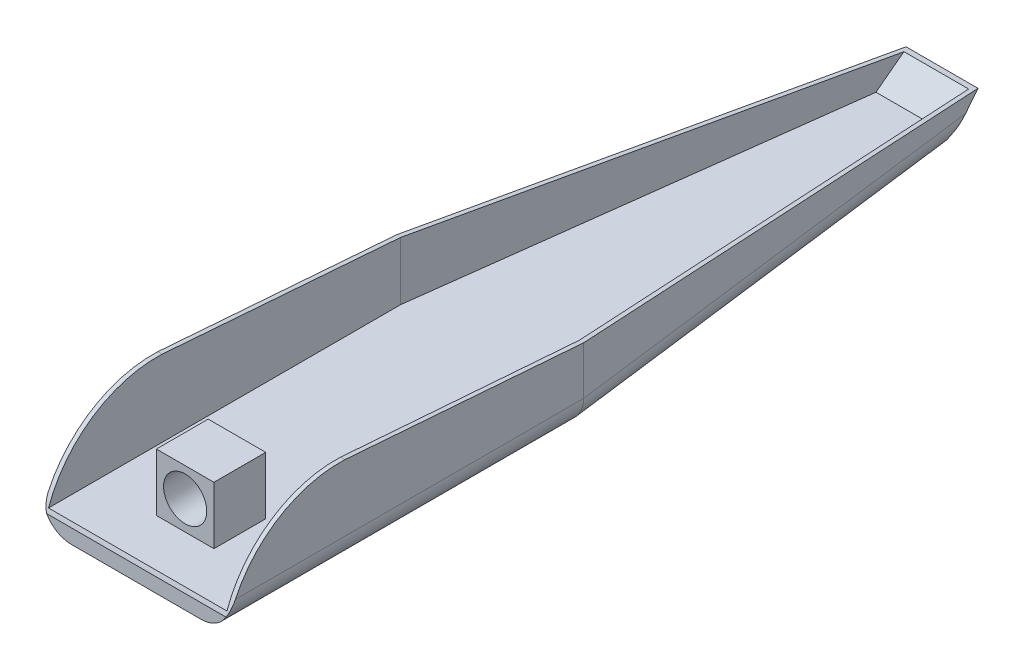
ISO-10303-21;
HEADER;
FILE_DESCRIPTION(('STEP AP214'),'2;1');
FILE_NAME('part.step','',(''),(''),'','','');
FILE_SCHEMA(('AUTOMOTIVE_DESIGN { 1 0 10303 214 1 1 1 1 }'));
ENDSEC;
DATA;
#1=APPLICATION_CONTEXT('core data for automotive mechanical design processes');
#2=APPLICATION_PROTOCOL_DEFINITION('international standard','automotive_design',2000,#1);
#3=PRODUCT_CONTEXT('',#1,'mechanical');
#4=PRODUCT('Part','Part','',(#3));
#5=PRODUCT_RELATED_PRODUCT_CATEGORY('part','',(#4));
#6=PRODUCT_DEFINITION_FORMATION('','',#4);
#7=PRODUCT_DEFINITION_CONTEXT('part definition',#1,'design');
#8=PRODUCT_DEFINITION('design','',#6,#7);
#9=PRODUCT_DEFINITION_SHAPE('','',#8);
#10=(LENGTH_UNIT() NAMED_UNIT(*) SI_UNIT(.MILLI.,.METRE.));
#11=(NAMED_UNIT(*) PLANE_ANGLE_UNIT() SI_UNIT($,.RADIAN.));
#12=(NAMED_UNIT(*) SI_UNIT($,.STERADIAN.) SOLID_ANGLE_UNIT());
#13=UNCERTAINTY_MEASURE_WITH_UNIT(LENGTH_MEASURE(1.E-05),#10,'distance_accuracy_value','');
#14=(GEOMETRIC_REPRESENTATION_CONTEXT(3) GLOBAL_UNCERTAINTY_ASSIGNED_CONTEXT((#13)) GLOBAL_UNIT_ASSIGNED_CONTEXT((#10,
#11,#12)) REPRESENTATION_CONTEXT('',''));
#15=CARTESIAN_POINT('',(0.,0.,0.));
#16=DIRECTION('',(0.,0.,1.));
#17=DIRECTION('',(1.,0.,0.));
#18=AXIS2_PLACEMENT_3D('',#15,#16,#17);
#19=CARTESIAN_POINT('',(65.,1.5,106.357678166438));
#20=DIRECTION('',(0.,1.,0.));
#21=DIRECTION('',(0.,0.,1.));
#22=AXIS2_PLACEMENT_3D('',#19,#20,#21);
#23=PLANE('',#22);
#24=DIRECTION('',(-0.126367327048423,0.,-0.99198351733012));
#25=VECTOR('',#24,1.);
#26=CARTESIAN_POINT('',(78.9306043080202,1.5,104.583078891531));
#27=LINE('',#26,#25);
#28=CARTESIAN_POINT('',(63.5,1.5,-16.5471649264268));
#29=VERTEX_POINT('',#28);
#30=CARTESIAN_POINT('',(44.8397726787976,1.5,-163.029949397866));
#31=VERTEX_POINT('',#30);
#32=EDGE_CURVE('E213',#29,#31,#27,.T.);
#33=ORIENTED_EDGE('',*,*,#32,.T.);
#34=DIRECTION('',(-1.,0.,0.));
#35=VECTOR('',#34,1.);
#36=CARTESIAN_POINT('',(65.,1.5,-163.029949397866));
#37=LINE('',#36,#35);
#38=CARTESIAN_POINT('',(20.1602273212024,1.5,-163.029949397866));
#39=VERTEX_POINT('',#38);
#40=EDGE_CURVE('E230',#31,#39,#37,.T.);
#41=ORIENTED_EDGE('',*,*,#40,.T.);
#42=DIRECTION('',(0.126367327048423,0.,-0.99198351733012));
#43=VECTOR('',#42,1.);
#44=CARTESIAN_POINT('',(-12.8926387205716,1.5,96.4350490300599));
#45=LINE('',#44,#43);
#46=CARTESIAN_POINT('',(1.5,1.5,-16.5471649264268));
#47=VERTEX_POINT('',#46);
#48=EDGE_CURVE('E226',#47,#39,#45,.T.);
#49=ORIENTED_EDGE('',*,*,#48,.F.);
#50=DIRECTION('',(0.,0.,-1.));
#51=VECTOR('',#50,1.);
#52=CARTESIAN_POINT('',(1.5,1.5,68.1715355699288));
#53=LINE('',#52,#51);
#54=CARTESIAN_POINT('',(1.5,1.5,105.857145726091));
#55=VERTEX_POINT('',#54);
#56=EDGE_CURVE('E221',#55,#47,#53,.T.);
#57=ORIENTED_EDGE('',*,*,#56,.F.);
#58=DIRECTION('',(-1.,0.,0.));
#59=VECTOR('',#58,1.);
#60=CARTESIAN_POINT('',(63.5,1.5,105.857145726091));
#61=LINE('',#60,#59);
#62=CARTESIAN_POINT('',(63.5,1.5,105.857145726091));
#63=VERTEX_POINT('',#62);
#64=EDGE_CURVE('E232',#63,#55,#61,.T.);
#65=ORIENTED_EDGE('',*,*,#64,.F.);
#66=DIRECTION('',(0.,0.,-1.));
#67=VECTOR('',#66,1.);
#68=CARTESIAN_POINT('',(63.5,1.5,68.1715355699288));
#69=LINE('',#68,#67);
#70=EDGE_CURVE('E217',#63,#29,#69,.T.);
#71=ORIENTED_EDGE('',*,*,#70,.T.);
#72=EDGE_LOOP('',(#33,#41,#49,#57,#65,#71));
#73=FACE_BOUND('',#72,.T.);
#74=DIRECTION('',(-1.,0.,0.));
#75=VECTOR('',#74,1.);
#76=CARTESIAN_POINT('',(22.5,1.5,71.3649853274635));
#77=LINE('',#76,#75);
#78=CARTESIAN_POINT('',(42.5,1.5,71.3649853274635));
#79=VERTEX_POINT('',#78);
#80=CARTESIAN_POINT('',(22.5,1.5,71.3649853274635));
#81=VERTEX_POINT('',#80);
#82=EDGE_CURVE('E465',#79,#81,#77,.T.);
#83=ORIENTED_EDGE('',*,*,#82,.F.);
#84=DIRECTION('',(0.,0.,-1.));
#85=VECTOR('',#84,1.);
#86=CARTESIAN_POINT('',(42.5,1.5,71.3649853274635));
#87=LINE('',#86,#85);
#88=CARTESIAN_POINT('',(42.5,1.5,89.3649853274635));
#89=VERTEX_POINT('',#88);
#90=EDGE_CURVE('E202',#89,#79,#87,.T.);
#91=ORIENTED_EDGE('',*,*,#90,.F.);
#92=DIRECTION('',(1.,0.,0.));
#93=VECTOR('',#92,1.);
#94=CARTESIAN_POINT('',(22.5,1.5,89.3649853274635));
#95=LINE('',#94,#93);
#96=CARTESIAN_POINT('',(22.5,1.5,89.3649853274635));
#97=VERTEX_POINT('',#96);
#98=EDGE_CURVE('E198',#97,#89,#95,.T.);
#99=ORIENTED_EDGE('',*,*,#98,.F.);
#100=DIRECTION('',(0.,0.,1.));
#101=VECTOR('',#100,1.);
#102=CARTESIAN_POINT('',(22.5,1.5,71.3649853274635));
#103=LINE('',#102,#101);
#104=EDGE_CURVE('E467',#81,#97,#103,.T.);
#105=ORIENTED_EDGE('',*,*,#104,.F.);
#106=EDGE_LOOP('',(#83,#91,#99,#105));
#107=FACE_BOUND('',#106,.T.);
#108=ADVANCED_FACE('F34',(#73,#107),#23,.T.);
#109=CARTESIAN_POINT('',(65.,9.7979589711327,-173.642321833562));
#110=DIRECTION('',(0.,-0.997120639636203,0.0758315897992965));
#111=DIRECTION('',(0.,-0.0758315897992965,-0.997120639636203));
#112=AXIS2_PLACEMENT_3D('',#109,#110,#111);
#113=PLANE('',#112);
#114=DIRECTION('',(0.,0.0758315897992965,0.997120639636203));
#115=VECTOR('',#114,1.);
#116=CARTESIAN_POINT('',(1.5,27.9574660545375,65.1396866461128));
#117=LINE('',#116,#115);
#118=CARTESIAN_POINT('',(1.5,21.7451346934047,-16.5471649264268));
#119=VERTEX_POINT('',#118);
#120=CARTESIAN_POINT('',(1.5,28.050095,66.3576781664384));
#121=VERTEX_POINT('',#120);
#122=EDGE_CURVE('E224',#119,#121,#117,.T.);
#123=ORIENTED_EDGE('',*,*,#122,.F.);
#124=DIRECTION('',(-0.126009255628087,0.0752271411907011,0.989172656680485));
#125=VECTOR('',#124,1.);
#126=CARTESIAN_POINT('',(22.2026368873768,9.38572362964019,-179.062864492335));
#127=LINE('',#126,#125);
#128=CARTESIAN_POINT('',(21.2587555879734,9.94921788586415,-171.653396292018));
#129=VERTEX_POINT('',#128);
#130=EDGE_CURVE('E216',#129,#119,#127,.T.);
#131=ORIENTED_EDGE('',*,*,#130,.F.);
#132=DIRECTION('',(-1.,0.,0.));
#133=VECTOR('',#132,1.);
#134=CARTESIAN_POINT('',(65.,9.94921788586415,-171.653396292018));
#135=LINE('',#134,#133);
#136=CARTESIAN_POINT('',(43.7412444120266,9.94921788586415,-171.653396292018));
#137=VERTEX_POINT('',#136);
#138=EDGE_CURVE('E233',#137,#129,#135,.T.);
#139=ORIENTED_EDGE('',*,*,#138,.F.);
#140=DIRECTION('',(0.126009255628087,0.0752271411907011,0.989172656680485));
#141=VECTOR('',#140,1.);
#142=CARTESIAN_POINT('',(43.8294547253796,10.0018791738307,-170.960945332197));
#143=LINE('',#142,#141);
#144=CARTESIAN_POINT('',(63.5,21.7451346934047,-16.5471649264268));
#145=VERTEX_POINT('',#144);
#146=EDGE_CURVE('E204',#137,#145,#143,.T.);
#147=ORIENTED_EDGE('',*,*,#146,.T.);
#148=DIRECTION('',(0.,0.0758315897992965,0.997120639636203));
#149=VECTOR('',#148,1.);
#150=CARTESIAN_POINT('',(63.5,27.9574660545375,65.1396866461128));
#151=LINE('',#150,#149);
#152=CARTESIAN_POINT('',(63.5,28.050095,66.3576781664384));
#153=VERTEX_POINT('',#152);
#154=EDGE_CURVE('E219',#145,#153,#151,.T.);
#155=ORIENTED_EDGE('',*,*,#154,.T.);
#156=DIRECTION('',(-1.,0.,0.));
#157=VECTOR('',#156,1.);
#158=CARTESIAN_POINT('',(65.,28.050095,66.3576781664384));
#159=LINE('',#158,#157);
#160=CARTESIAN_POINT('',(65.,28.050095,66.3576781664384));
#161=VERTEX_POINT('',#160);
#162=EDGE_CURVE('E277',#161,#153,#159,.T.);
#163=ORIENTED_EDGE('',*,*,#162,.F.);
#164=DIRECTION('',(0.,0.0758315897992965,0.997120639636203));
#165=VECTOR('',#164,1.);
#166=CARTESIAN_POINT('',(65.,9.7979589711327,-173.642321833562));
#167=LINE('',#166,#165);
#168=CARTESIAN_POINT('',(65.,21.7378979566834,-16.6423218335616));
#169=VERTEX_POINT('',#168);
#170=EDGE_CURVE('E269',#169,#161,#167,.T.);
#171=ORIENTED_EDGE('',*,*,#170,.F.);
#172=DIRECTION('',(0.126009255628087,0.0752271411907011,0.989172656680485));
#173=VECTOR('',#172,1.);
#174=CARTESIAN_POINT('',(45.3175666500789,9.98754529242209,-171.149423630442));
#175=LINE('',#174,#173);
#176=CARTESIAN_POINT('',(45.,9.7979589711327,-173.642321833562));
#177=VERTEX_POINT('',#176);
#178=EDGE_CURVE('E244',#177,#169,#175,.T.);
#179=ORIENTED_EDGE('',*,*,#178,.F.);
#180=DIRECTION('',(-1.,0.,0.));
#181=VECTOR('',#180,1.);
#182=CARTESIAN_POINT('',(65.,9.7979589711327,-173.642321833562));
#183=LINE('',#182,#181);
#184=CARTESIAN_POINT('',(20.,9.7979589711327,-173.642321833562));
#185=VERTEX_POINT('',#184);
#186=EDGE_CURVE('E280',#177,#185,#183,.T.);
#187=ORIENTED_EDGE('',*,*,#186,.T.);
#188=DIRECTION('',(-0.126009255628087,0.0752271411907011,0.989172656680485));
#189=VECTOR('',#188,1.);
#190=CARTESIAN_POINT('',(20.7145249626775,9.37138974823158,-179.25134279058));
#191=LINE('',#190,#189);
#192=CARTESIAN_POINT('',(0.,21.7378979566834,-16.6423218335616));
#193=VERTEX_POINT('',#192);
#194=EDGE_CURVE('E260',#185,#193,#191,.T.);
#195=ORIENTED_EDGE('',*,*,#194,.T.);
#196=DIRECTION('',(0.,0.0758315897992965,0.997120639636203));
#197=VECTOR('',#196,1.);
#198=CARTESIAN_POINT('',(0.,9.7979589711327,-173.642321833562));
#199=LINE('',#198,#197);
#200=CARTESIAN_POINT('',(0.,28.050095,66.3576781664384));
#201=VERTEX_POINT('',#200);
#202=EDGE_CURVE('E270',#193,#201,#199,.T.);
#203=ORIENTED_EDGE('',*,*,#202,.T.);
#204=EDGE_CURVE('E272',#121,#201,#159,.T.);
#205=ORIENTED_EDGE('',*,*,#204,.F.);
#206=EDGE_LOOP('',(#123,#131,#139,#147,#155,#163,#171,#179,#187,#195,#203,#205));
#207=FACE_BOUND('',#206,.T.);
#208=ADVANCED_FACE('F326',(#207),#113,.F.);
#209=CARTESIAN_POINT('',(65.,-11.9087578529011,68.1715355699288));
#210=DIRECTION('',(-1.,0.,0.));
#211=DIRECTION('',(0.,0.,1.));
#212=AXIS2_PLACEMENT_3D('',#209,#210,#211);
#213=CYLINDRICAL_SURFACE('',#212,40.);
#214=DIRECTION('',(-1.,0.,0.));
#215=VECTOR('',#214,1.);
#216=CARTESIAN_POINT('',(65.,0.,106.357678166438));
#217=LINE('',#216,#215);
#218=CARTESIAN_POINT('',(63.6602540378444,0.,106.357678166438));
#219=VERTEX_POINT('',#218);
#220=CARTESIAN_POINT('',(1.33974596215561,0.,106.357678166438));
#221=VERTEX_POINT('',#220);
#222=EDGE_CURVE('E285',#219,#221,#217,.T.);
#223=ORIENTED_EDGE('',*,*,#222,.F.);
#224=CARTESIAN_POINT('',(63.6602540378444,0.,106.357678166438));
#225=CARTESIAN_POINT('',(63.7339797398469,0.12769563811019,106.317855781105));
#226=CARTESIAN_POINT('',(63.8047157120204,0.256738705842162,106.276908324914));
#227=CARTESIAN_POINT('',(63.9401517282263,0.517228586223342,106.192761083659));
#228=CARTESIAN_POINT('',(64.0048520208726,0.648675299597738,106.14956139148));
#229=CARTESIAN_POINT('',(64.1897708059352,1.04608714422319,106.016613454126));
#230=CARTESIAN_POINT('',(64.3008702185088,1.31523345498381,105.923482366086));
#231=CARTESIAN_POINT('',(64.496320074196,1.85353884673408,105.730546103038));
#232=CARTESIAN_POINT('',(64.5811845551728,2.12257829644108,105.630922780428));
#233=CARTESIAN_POINT('',(64.7273415057088,2.66389876925302,105.423670881566));
#234=CARTESIAN_POINT('',(64.7886404395499,2.93617888225093,105.316044510318));
#235=CARTESIAN_POINT('',(64.8653495565833,3.35753141162984,105.144041951686));
#236=CARTESIAN_POINT('',(64.8889444738386,3.50624129852001,105.08229165286));
#237=CARTESIAN_POINT('',(64.9293132588374,3.803654531085,104.956669814262));
#238=CARTESIAN_POINT('',(64.9460886223502,3.95235787103346,104.892798742978));
#239=CARTESIAN_POINT('',(64.9866402340936,4.40153601591828,104.69662506843));
#240=CARTESIAN_POINT('',(65.0000160178162,4.70161458803926,104.56117466784));
#241=CARTESIAN_POINT('',(65.,5.,104.421968779367));
#242=B_SPLINE_CURVE_WITH_KNOTS('',3,(#224,#225,#226,#227,#228,#229,#230,#231,#232,#233,#234,
#235,#236,#237,#238,#239,#240,#241),.UNSPECIFIED.,.F.,.F.,(4,2,2,2,2,2,2,2,4),(0.,
0.45811566035427,0.916212442267594,1.83201501087076,2.72853161652839,3.62480212231146,
4.11288683172061,4.60086442905591,5.58815856332892),.UNSPECIFIED.);
#243=CARTESIAN_POINT('',(65.,5.,104.421968779367));
#244=VERTEX_POINT('',#243);
#245=EDGE_CURVE('E312',#219,#244,#242,.T.);
#246=ORIENTED_EDGE('',*,*,#245,.T.);
#247=CARTESIAN_POINT('',(65.,-11.9087578529011,68.1715355699288));
#248=DIRECTION('',(1.,0.,0.));
#249=DIRECTION('',(0.,0.,1.));
#250=AXIS2_PLACEMENT_3D('',#247,#248,#249);
#251=CIRCLE('',#250,40.);
#252=EDGE_CURVE('E266',#161,#244,#251,.T.);
#253=ORIENTED_EDGE('',*,*,#252,.F.);
#254=ORIENTED_EDGE('',*,*,#162,.T.);
#255=CARTESIAN_POINT('',(63.5,-11.9087578529011,68.1715355699288));
#256=DIRECTION('',(-1.,0.,0.));
#257=DIRECTION('',(0.,0.,1.));
#258=AXIS2_PLACEMENT_3D('',#255,#256,#257);
#259=CIRCLE('',#258,40.);
#260=EDGE_CURVE('E220',#153,#63,#259,.F.);
#261=ORIENTED_EDGE('',*,*,#260,.T.);
#262=ORIENTED_EDGE('',*,*,#64,.T.);
#263=CARTESIAN_POINT('',(1.5,-11.9087578529011,68.1715355699288));
#264=DIRECTION('',(-1.,0.,0.));
#265=DIRECTION('',(0.,0.,1.));
#266=AXIS2_PLACEMENT_3D('',#263,#264,#265);
#267=CIRCLE('',#266,40.);
#268=EDGE_CURVE('E225',#121,#55,#267,.F.);
#269=ORIENTED_EDGE('',*,*,#268,.F.);
#270=ORIENTED_EDGE('',*,*,#204,.T.);
#271=CARTESIAN_POINT('',(0.,-11.9087578529011,68.1715355699288));
#272=DIRECTION('',(1.,0.,0.));
#273=DIRECTION('',(0.,0.,1.));
#274=AXIS2_PLACEMENT_3D('',#271,#272,#273);
#275=CIRCLE('',#274,40.);
#276=CARTESIAN_POINT('',(0.,5.,104.421968779367));
#277=VERTEX_POINT('',#276);
#278=EDGE_CURVE('E265',#201,#277,#275,.T.);
#279=ORIENTED_EDGE('',*,*,#278,.T.);
#280=CARTESIAN_POINT('',(0.,5.,104.421968779367));
#281=CARTESIAN_POINT('',(-2.51534967353453E-05,4.72318917845817,104.551120804387));
#282=CARTESIAN_POINT('',(0.0114943654473195,4.44481839745433,104.677069606174));
#283=CARTESIAN_POINT('',(0.0582204004957466,3.88673011003889,104.921975141028));
#284=CARTESIAN_POINT('',(0.0934461071013021,3.60701169498014,105.040926124359));
#285=CARTESIAN_POINT('',(0.18714894146458,3.05455961810868,105.268524477116));
#286=CARTESIAN_POINT('',(0.245101129967275,2.78180689982208,105.377340206725));
#287=CARTESIAN_POINT('',(0.384509513672707,2.23943660886376,105.586947534176));
#288=CARTESIAN_POINT('',(0.46595213631461,1.9698173190428,105.687743722851));
#289=CARTESIAN_POINT('',(0.660635732334455,1.41241013623589,105.889459129146));
#290=CARTESIAN_POINT('',(0.776032306101045,1.12509146808775,105.989620589702));
#291=CARTESIAN_POINT('',(0.970616398665921,0.699417840171919,106.132788830544));
#292=CARTESIAN_POINT('',(1.03954398386242,0.5575671344023,106.179594386958));
#293=CARTESIAN_POINT('',(1.18440629431007,0.276623774913063,106.270594428999));
#294=CARTESIAN_POINT('',(1.26034137947011,0.137531263301979,106.314788780321));
#295=CARTESIAN_POINT('',(1.33974596215561,0.,106.357678166438));
#296=B_SPLINE_CURVE_WITH_KNOTS('',3,(#280,#281,#282,#283,#284,#285,#286,#287,#288,#289,#290,
#291,#292,#293,#294,#295),.UNSPECIFIED.,.F.,.F.,(4,2,2,2,2,2,2,4),(0.,0.916224674996844,
1.83319194069664,2.73012058072988,3.62653201809577,4.60121558657625,5.09457728988511,
5.58796434662839),.UNSPECIFIED.);
#297=EDGE_CURVE('E306',#277,#221,#296,.T.);
#298=ORIENTED_EDGE('',*,*,#297,.T.);
#299=EDGE_LOOP('',(#223,#246,#253,#254,#261,#262,#269,#270,#279,#298));
#300=FACE_BOUND('',#299,.T.);
#301=ADVANCED_FACE('F321',(#300),#213,.T.);
#302=CARTESIAN_POINT('',(65.,0.,-163.642321833562));
#303=DIRECTION('',(0.,0.714285714285715,0.699854212223764));
#304=DIRECTION('',(0.,-0.699854212223765,0.714285714285715));
#305=AXIS2_PLACEMENT_3D('',#302,#303,#304);
#306=PLANE('',#305);
#307=DIRECTION('',(-1.,0.,0.));
#308=VECTOR('',#307,1.);
#309=CARTESIAN_POINT('',(65.,0.,-163.642321833562));
#310=LINE('',#309,#308);
#311=CARTESIAN_POINT('',(44.923312544672,0.,-163.642321833562));
#312=VERTEX_POINT('',#311);
#313=CARTESIAN_POINT('',(20.076687455328,0.,-163.642321833562));
#314=VERTEX_POINT('',#313);
#315=EDGE_CURVE('E283',#312,#314,#310,.T.);
#316=ORIENTED_EDGE('',*,*,#315,.T.);
#317=CARTESIAN_POINT('',(29.4570042053117,5.,-168.74542546436));
#318=DIRECTION('',(0.,0.714285714285715,0.699854212223764));
#319=DIRECTION('',(0.175573608737436,0.688982891140887,-0.703190218667793));
#320=AXIS2_PLACEMENT_3D('',#317,#318,#319);
#321=ELLIPSE('',#320,14.4041608722417,10.);
#322=CARTESIAN_POINT('',(19.3761915453246,5.00000000000001,-168.74542546436));
#323=VERTEX_POINT('',#322);
#324=EDGE_CURVE('E51',#314,#323,#321,.F.);
#325=ORIENTED_EDGE('',*,*,#324,.T.);
#326=DIRECTION('',(0.0906174499960248,0.696974854846829,-0.711346982468794));
#327=VECTOR('',#326,1.);
#328=CARTESIAN_POINT('',(19.1060936885419,2.92256994062573,-166.625157288615));
#329=LINE('',#328,#327);
#330=EDGE_CURVE('E263',#323,#185,#329,.T.);
#331=ORIENTED_EDGE('',*,*,#330,.T.);
#332=ORIENTED_EDGE('',*,*,#186,.F.);
#333=DIRECTION('',(-0.0906174499960248,0.696974854846829,-0.711346982468794));
#334=VECTOR('',#333,1.);
#335=CARTESIAN_POINT('',(46.4276552573039,-1.18270552311626,-162.435228063726));
#336=LINE('',#335,#334);
#337=CARTESIAN_POINT('',(45.6238084546754,5.,-168.74542546436));
#338=VERTEX_POINT('',#337);
#339=EDGE_CURVE('E258',#338,#177,#336,.T.);
#340=ORIENTED_EDGE('',*,*,#339,.F.);
#341=CARTESIAN_POINT('',(35.5429957946883,5.,-168.74542546436));
#342=DIRECTION('',(0.,0.714285714285715,0.699854212223764));
#343=DIRECTION('',(-0.175573608737436,0.688982891140887,-0.703190218667793));
#344=AXIS2_PLACEMENT_3D('',#341,#342,#343);
#345=ELLIPSE('',#344,14.4041608722417,10.);
#346=EDGE_CURVE('E422',#338,#312,#345,.F.);
#347=ORIENTED_EDGE('',*,*,#346,.T.);
#348=EDGE_LOOP('',(#316,#325,#331,#332,#340,#347));
#349=FACE_BOUND('',#348,.T.);
#350=ADVANCED_FACE('F325',(#349),#306,.F.);
#351=CARTESIAN_POINT('',(65.,-11.9087578529011,68.1715355699288));
#352=DIRECTION('',(-1.,0.,0.));
#353=DIRECTION('',(0.,0.,1.));
#354=AXIS2_PLACEMENT_3D('',#351,#352,#353);
#355=PLANE('',#354);
#356=ORIENTED_EDGE('',*,*,#252,.T.);
#357=DIRECTION('',(0.,0.,1.));
#358=VECTOR('',#357,1.);
#359=CARTESIAN_POINT('',(65.,5.,68.1715355699288));
#360=LINE('',#359,#358);
#361=CARTESIAN_POINT('',(65.,5.,-16.6423218335616));
#362=VERTEX_POINT('',#361);
#363=EDGE_CURVE('E405',#244,#362,#360,.F.);
#364=ORIENTED_EDGE('',*,*,#363,.T.);
#365=DIRECTION('',(0.,-1.,0.));
#366=VECTOR('',#365,1.);
#367=CARTESIAN_POINT('',(65.,-11.9087578529011,-16.6423218335616));
#368=LINE('',#367,#366);
#369=EDGE_CURVE('E290',#169,#362,#368,.T.);
#370=ORIENTED_EDGE('',*,*,#369,.F.);
#371=ORIENTED_EDGE('',*,*,#170,.T.);
#372=EDGE_LOOP('',(#356,#364,#370,#371));
#373=FACE_BOUND('',#372,.T.);
#374=ADVANCED_FACE('F384',(#373),#355,.F.);
#375=CARTESIAN_POINT('',(0.,-11.9087578529011,68.1715355699288));
#376=DIRECTION('',(-1.,0.,0.));
#377=DIRECTION('',(0.,0.,1.));
#378=AXIS2_PLACEMENT_3D('',#375,#376,#377);
#379=PLANE('',#378);
#380=DIRECTION('',(0.,1.,0.));
#381=VECTOR('',#380,1.);
#382=CARTESIAN_POINT('',(0.,-11.9087578529011,-16.6423218335616));
#383=LINE('',#382,#381);
#384=CARTESIAN_POINT('',(0.,5.,-16.6423218335616));
#385=VERTEX_POINT('',#384);
#386=EDGE_CURVE('E288',#385,#193,#383,.T.);
#387=ORIENTED_EDGE('',*,*,#386,.F.);
#388=DIRECTION('',(0.,0.,-1.));
#389=VECTOR('',#388,1.);
#390=CARTESIAN_POINT('',(0.,5.,106.357678166438));
#391=LINE('',#390,#389);
#392=EDGE_CURVE('E396',#385,#277,#391,.F.);
#393=ORIENTED_EDGE('',*,*,#392,.T.);
#394=ORIENTED_EDGE('',*,*,#278,.F.);
#395=ORIENTED_EDGE('',*,*,#202,.F.);
#396=EDGE_LOOP('',(#387,#393,#394,#395));
#397=FACE_BOUND('',#396,.T.);
#398=ADVANCED_FACE('F382',(#397),#379,.T.);
#399=CARTESIAN_POINT('',(0.,-361.018779561238,-16.6423218335616));
#400=DIRECTION('',(0.99198351733012,0.,0.126367327048423));
#401=DIRECTION('',(0.126367327048423,0.,-0.99198351733012));
#402=AXIS2_PLACEMENT_3D('',#399,#400,#401);
#403=PLANE('',#402);
#404=ORIENTED_EDGE('',*,*,#330,.F.);
#405=DIRECTION('',(0.126367327048423,0.,-0.99198351733012));
#406=VECTOR('',#405,1.);
#407=CARTESIAN_POINT('',(0.,5.,-16.6423218335616));
#408=LINE('',#407,#406);
#409=EDGE_CURVE('E43',#323,#385,#408,.F.);
#410=ORIENTED_EDGE('',*,*,#409,.T.);
#411=ORIENTED_EDGE('',*,*,#386,.T.);
#412=ORIENTED_EDGE('',*,*,#194,.F.);
#413=EDGE_LOOP('',(#404,#410,#411,#412));
#414=FACE_BOUND('',#413,.T.);
#415=ADVANCED_FACE('F379',(#414),#403,.F.);
#416=CARTESIAN_POINT('',(65.,-361.018779561238,-16.6423218335616));
#417=DIRECTION('',(0.99198351733012,0.,-0.126367327048423));
#418=DIRECTION('',(-0.126367327048423,0.,-0.99198351733012));
#419=AXIS2_PLACEMENT_3D('',#416,#417,#418);
#420=PLANE('',#419);
#421=ORIENTED_EDGE('',*,*,#369,.T.);
#422=DIRECTION('',(0.126367327048423,0.,0.99198351733012));
#423=VECTOR('',#422,1.);
#424=CARTESIAN_POINT('',(46.2738853503185,5.,-163.642321833562));
#425=LINE('',#424,#423);
#426=EDGE_CURVE('E11',#362,#338,#425,.F.);
#427=ORIENTED_EDGE('',*,*,#426,.T.);
#428=ORIENTED_EDGE('',*,*,#339,.T.);
#429=ORIENTED_EDGE('',*,*,#178,.T.);
#430=EDGE_LOOP('',(#421,#427,#428,#429));
#431=FACE_BOUND('',#430,.T.);
#432=ADVANCED_FACE('F360',(#431),#420,.T.);
#433=CARTESIAN_POINT('',(65.,1.07142857142857,-162.592540515226));
#434=DIRECTION('',(0.,0.714285714285715,0.699854212223764));
#435=DIRECTION('',(0.,-0.699854212223765,0.714285714285715));
#436=AXIS2_PLACEMENT_3D('',#433,#434,#435);
#437=PLANE('',#436);
#438=DIRECTION('',(-0.0906174499960248,0.696974854846829,-0.711346982468794));
#439=VECTOR('',#438,1.);
#440=CARTESIAN_POINT('',(45.0605821574357,-0.198333536524869,-161.296594990556));
#441=LINE('',#440,#439);
#442=EDGE_CURVE('E207',#31,#137,#441,.T.);
#443=ORIENTED_EDGE('',*,*,#442,.T.);
#444=ORIENTED_EDGE('',*,*,#138,.T.);
#445=DIRECTION('',(0.0906174499960248,0.696974854846829,-0.711346982468794));
#446=VECTOR('',#445,1.);
#447=CARTESIAN_POINT('',(20.4731667884101,3.90694192721713,-165.486524215446));
#448=LINE('',#447,#446);
#449=EDGE_CURVE('E229',#39,#129,#448,.T.);
#450=ORIENTED_EDGE('',*,*,#449,.F.);
#451=ORIENTED_EDGE('',*,*,#40,.F.);
#452=EDGE_LOOP('',(#443,#444,#450,#451));
#453=FACE_BOUND('',#452,.T.);
#454=ADVANCED_FACE('F356',(#453),#437,.T.);
#455=CARTESIAN_POINT('',(63.5,-11.9087578529011,68.1715355699288));
#456=DIRECTION('',(-1.,0.,0.));
#457=DIRECTION('',(0.,0.,1.));
#458=AXIS2_PLACEMENT_3D('',#455,#456,#457);
#459=PLANE('',#458);
#460=DIRECTION('',(0.,-1.,0.));
#461=VECTOR('',#460,1.);
#462=CARTESIAN_POINT('',(63.5,-11.9087578529011,-16.5471649264268));
#463=LINE('',#462,#461);
#464=EDGE_CURVE('E241',#145,#29,#463,.T.);
#465=ORIENTED_EDGE('',*,*,#464,.T.);
#466=ORIENTED_EDGE('',*,*,#70,.F.);
#467=ORIENTED_EDGE('',*,*,#260,.F.);
#468=ORIENTED_EDGE('',*,*,#154,.F.);
#469=EDGE_LOOP('',(#465,#466,#467,#468));
#470=FACE_BOUND('',#469,.T.);
#471=ADVANCED_FACE('F359',(#470),#459,.T.);
#472=CARTESIAN_POINT('',(1.5,-11.9087578529011,68.1715355699288));
#473=DIRECTION('',(-1.,0.,0.));
#474=DIRECTION('',(0.,0.,1.));
#475=AXIS2_PLACEMENT_3D('',#472,#473,#474);
#476=PLANE('',#475);
#477=DIRECTION('',(0.,1.,0.));
#478=VECTOR('',#477,1.);
#479=CARTESIAN_POINT('',(1.5,-11.9087578529011,-16.5471649264268));
#480=LINE('',#479,#478);
#481=EDGE_CURVE('E238',#47,#119,#480,.T.);
#482=ORIENTED_EDGE('',*,*,#481,.T.);
#483=ORIENTED_EDGE('',*,*,#122,.T.);
#484=ORIENTED_EDGE('',*,*,#268,.T.);
#485=ORIENTED_EDGE('',*,*,#56,.T.);
#486=EDGE_LOOP('',(#482,#483,#484,#485));
#487=FACE_BOUND('',#486,.T.);
#488=ADVANCED_FACE('F364',(#487),#476,.F.);
#489=CARTESIAN_POINT('',(1.48797527599518,-361.018779561238,-16.452770842989));
#490=DIRECTION('',(0.99198351733012,0.,0.126367327048423));
#491=DIRECTION('',(0.126367327048423,0.,-0.99198351733012));
#492=AXIS2_PLACEMENT_3D('',#489,#490,#491);
#493=PLANE('',#492);
#494=ORIENTED_EDGE('',*,*,#48,.T.);
#495=ORIENTED_EDGE('',*,*,#449,.T.);
#496=ORIENTED_EDGE('',*,*,#130,.T.);
#497=ORIENTED_EDGE('',*,*,#481,.F.);
#498=EDGE_LOOP('',(#494,#495,#496,#497));
#499=FACE_BOUND('',#498,.T.);
#500=ADVANCED_FACE('F368',(#499),#493,.T.);
#501=CARTESIAN_POINT('',(63.5120247240048,-361.018779561238,-16.4527708429889));
#502=DIRECTION('',(0.99198351733012,0.,-0.126367327048423));
#503=DIRECTION('',(-0.126367327048423,0.,-0.99198351733012));
#504=AXIS2_PLACEMENT_3D('',#501,#502,#503);
#505=PLANE('',#504);
#506=ORIENTED_EDGE('',*,*,#464,.F.);
#507=ORIENTED_EDGE('',*,*,#146,.F.);
#508=ORIENTED_EDGE('',*,*,#442,.F.);
#509=ORIENTED_EDGE('',*,*,#32,.F.);
#510=EDGE_LOOP('',(#506,#507,#508,#509));
#511=FACE_BOUND('',#510,.T.);
#512=ADVANCED_FACE('F372',(#511),#505,.F.);
#513=CARTESIAN_POINT('',(42.5,21.5,71.3649853274635));
#514=DIRECTION('',(-1.,0.,0.));
#515=DIRECTION('',(0.,0.,1.));
#516=AXIS2_PLACEMENT_3D('',#513,#514,#515);
#517=PLANE('',#516);
#518=ORIENTED_EDGE('',*,*,#90,.T.);
#519=DIRECTION('',(0.,-1.,0.));
#520=VECTOR('',#519,1.);
#521=CARTESIAN_POINT('',(42.5,21.5,71.3649853274635));
#522=LINE('',#521,#520);
#523=CARTESIAN_POINT('',(42.5,21.5,71.3649853274635));
#524=VERTEX_POINT('',#523);
#525=EDGE_CURVE('E182',#524,#79,#522,.T.);
#526=ORIENTED_EDGE('',*,*,#525,.F.);
#527=DIRECTION('',(0.,0.,-1.));
#528=VECTOR('',#527,1.);
#529=CARTESIAN_POINT('',(42.5,21.5,71.3649853274635));
#530=LINE('',#529,#528);
#531=CARTESIAN_POINT('',(42.5,21.5,89.3649853274635));
#532=VERTEX_POINT('',#531);
#533=EDGE_CURVE('E189',#532,#524,#530,.T.);
#534=ORIENTED_EDGE('',*,*,#533,.F.);
#535=DIRECTION('',(0.,-1.,0.));
#536=VECTOR('',#535,1.);
#537=CARTESIAN_POINT('',(42.5,21.5,89.3649853274635));
#538=LINE('',#537,#536);
#539=EDGE_CURVE('E463',#532,#89,#538,.T.);
#540=ORIENTED_EDGE('',*,*,#539,.T.);
#541=EDGE_LOOP('',(#518,#526,#534,#540));
#542=FACE_BOUND('',#541,.T.);
#543=ADVANCED_FACE('F200',(#542),#517,.F.);
#544=CARTESIAN_POINT('',(22.5,21.5,71.3649853274635));
#545=DIRECTION('',(0.,0.,1.));
#546=DIRECTION('',(1.,0.,0.));
#547=AXIS2_PLACEMENT_3D('',#544,#545,#546);
#548=PLANE('',#547);
#549=CARTESIAN_POINT('',(32.5,11.5,71.3649853274635));
#550=DIRECTION('',(0.,0.,1.));
#551=DIRECTION('',(1.,0.,0.));
#552=AXIS2_PLACEMENT_3D('',#549,#550,#551);
#553=CIRCLE('',#552,7.5);
#554=CARTESIAN_POINT('',(40.,11.5,71.3649853274635));
#555=VERTEX_POINT('',#554);
#556=EDGE_CURVE('E456',#555,#555,#553,.T.);
#557=ORIENTED_EDGE('',*,*,#556,.T.);
#558=EDGE_LOOP('',(#557));
#559=FACE_BOUND('',#558,.T.);
#560=ORIENTED_EDGE('',*,*,#82,.T.);
#561=DIRECTION('',(0.,-1.,0.));
#562=VECTOR('',#561,1.);
#563=CARTESIAN_POINT('',(22.5,21.5,71.3649853274635));
#564=LINE('',#563,#562);
#565=CARTESIAN_POINT('',(22.5,21.5,71.3649853274635));
#566=VERTEX_POINT('',#565);
#567=EDGE_CURVE('E185',#566,#81,#564,.T.);
#568=ORIENTED_EDGE('',*,*,#567,.F.);
#569=DIRECTION('',(-1.,0.,0.));
#570=VECTOR('',#569,1.);
#571=CARTESIAN_POINT('',(22.5,21.5,71.3649853274635));
#572=LINE('',#571,#570);
#573=EDGE_CURVE('E178',#524,#566,#572,.T.);
#574=ORIENTED_EDGE('',*,*,#573,.F.);
#575=ORIENTED_EDGE('',*,*,#525,.T.);
#576=EDGE_LOOP('',(#560,#568,#574,#575));
#577=FACE_BOUND('',#576,.T.);
#578=ADVANCED_FACE('F180',(#559,#577),#548,.F.);
#579=CARTESIAN_POINT('',(22.5,21.5,71.3649853274635));
#580=DIRECTION('',(1.,0.,0.));
#581=DIRECTION('',(0.,0.,-1.));
#582=AXIS2_PLACEMENT_3D('',#579,#580,#581);
#583=PLANE('',#582);
#584=ORIENTED_EDGE('',*,*,#104,.T.);
#585=DIRECTION('',(0.,-1.,0.));
#586=VECTOR('',#585,1.);
#587=CARTESIAN_POINT('',(22.5,21.5,89.3649853274635));
#588=LINE('',#587,#586);
#589=CARTESIAN_POINT('',(22.5,21.5,89.3649853274635));
#590=VERTEX_POINT('',#589);
#591=EDGE_CURVE('E209',#590,#97,#588,.T.);
#592=ORIENTED_EDGE('',*,*,#591,.F.);
#593=DIRECTION('',(0.,0.,1.));
#594=VECTOR('',#593,1.);
#595=CARTESIAN_POINT('',(22.5,21.5,71.3649853274635));
#596=LINE('',#595,#594);
#597=EDGE_CURVE('E188',#566,#590,#596,.T.);
#598=ORIENTED_EDGE('',*,*,#597,.F.);
#599=ORIENTED_EDGE('',*,*,#567,.T.);
#600=EDGE_LOOP('',(#584,#592,#598,#599));
#601=FACE_BOUND('',#600,.T.);
#602=ADVANCED_FACE('F477',(#601),#583,.F.);
#603=CARTESIAN_POINT('',(22.5,21.5,89.3649853274635));
#604=DIRECTION('',(0.,0.,-1.));
#605=DIRECTION('',(-1.,0.,0.));
#606=AXIS2_PLACEMENT_3D('',#603,#604,#605);
#607=PLANE('',#606);
#608=CARTESIAN_POINT('',(32.5,11.5,89.3649853274635));
#609=DIRECTION('',(0.,0.,1.));
#610=DIRECTION('',(1.,0.,0.));
#611=AXIS2_PLACEMENT_3D('',#608,#609,#610);
#612=CIRCLE('',#611,7.5);
#613=CARTESIAN_POINT('',(40.,11.5,89.3649853274635));
#614=VERTEX_POINT('',#613);
#615=EDGE_CURVE('E453',#614,#614,#612,.T.);
#616=ORIENTED_EDGE('',*,*,#615,.F.);
#617=EDGE_LOOP('',(#616));
#618=FACE_BOUND('',#617,.T.);
#619=ORIENTED_EDGE('',*,*,#98,.T.);
#620=ORIENTED_EDGE('',*,*,#539,.F.);
#621=DIRECTION('',(1.,0.,0.));
#622=VECTOR('',#621,1.);
#623=CARTESIAN_POINT('',(22.5,21.5,89.3649853274635));
#624=LINE('',#623,#622);
#625=EDGE_CURVE('E194',#590,#532,#624,.T.);
#626=ORIENTED_EDGE('',*,*,#625,.F.);
#627=ORIENTED_EDGE('',*,*,#591,.T.);
#628=EDGE_LOOP('',(#619,#620,#626,#627));
#629=FACE_BOUND('',#628,.T.);
#630=ADVANCED_FACE('F473',(#618,#629),#607,.F.);
#631=CARTESIAN_POINT('',(0.,21.5,0.));
#632=DIRECTION('',(0.,1.,0.));
#633=DIRECTION('',(0.,0.,1.));
#634=AXIS2_PLACEMENT_3D('',#631,#632,#633);
#635=PLANE('',#634);
#636=ORIENTED_EDGE('',*,*,#533,.T.);
#637=ORIENTED_EDGE('',*,*,#573,.T.);
#638=ORIENTED_EDGE('',*,*,#597,.T.);
#639=ORIENTED_EDGE('',*,*,#625,.T.);
#640=EDGE_LOOP('',(#636,#637,#638,#639));
#641=FACE_BOUND('',#640,.T.);
#642=ADVANCED_FACE('F192',(#641),#635,.T.);
#643=CARTESIAN_POINT('',(32.5,11.5,69.3649853274635));
#644=DIRECTION('',(0.,0.,1.));
#645=DIRECTION('',(1.,0.,0.));
#646=AXIS2_PLACEMENT_3D('',#643,#644,#645);
#647=CYLINDRICAL_SURFACE('',#646,7.5);
#648=ORIENTED_EDGE('',*,*,#615,.T.);
#649=EDGE_LOOP('',(#648));
#650=FACE_BOUND('',#649,.T.);
#651=ORIENTED_EDGE('',*,*,#556,.F.);
#652=EDGE_LOOP('',(#651));
#653=FACE_BOUND('',#652,.T.);
#654=ADVANCED_FACE('F490',(#650,#653),#647,.F.);
#655=CARTESIAN_POINT('',(65.,-5.,106.357678166438));
#656=DIRECTION('',(0.,0.,-1.));
#657=DIRECTION('',(-1.,0.,0.));
#658=AXIS2_PLACEMENT_3D('',#655,#656,#657);
#659=PLANE('',#658);
#660=DIRECTION('',(-1.,0.,0.));
#661=VECTOR('',#660,1.);
#662=CARTESIAN_POINT('',(65.,-5.,106.357678166438));
#663=LINE('',#662,#661);
#664=CARTESIAN_POINT('',(55.,-5.,106.357678166438));
#665=VERTEX_POINT('',#664);
#666=CARTESIAN_POINT('',(10.,-5.,106.357678166438));
#667=VERTEX_POINT('',#666);
#668=EDGE_CURVE('E412',#665,#667,#663,.T.);
#669=ORIENTED_EDGE('',*,*,#668,.F.);
#670=CARTESIAN_POINT('',(55.,5.,106.357678166438));
#671=DIRECTION('',(0.,0.,-1.));
#672=DIRECTION('',(-1.,0.,0.));
#673=AXIS2_PLACEMENT_3D('',#670,#671,#672);
#674=CIRCLE('',#673,10.);
#675=EDGE_CURVE('E304',#665,#219,#674,.F.);
#676=ORIENTED_EDGE('',*,*,#675,.T.);
#677=ORIENTED_EDGE('',*,*,#222,.T.);
#678=CARTESIAN_POINT('',(10.,5.,106.357678166438));
#679=DIRECTION('',(0.,0.,-1.));
#680=DIRECTION('',(-1.,0.,0.));
#681=AXIS2_PLACEMENT_3D('',#678,#679,#680);
#682=CIRCLE('',#681,10.);
#683=EDGE_CURVE('E302',#221,#667,#682,.F.);
#684=ORIENTED_EDGE('',*,*,#683,.T.);
#685=EDGE_LOOP('',(#669,#676,#677,#684));
#686=FACE_BOUND('',#685,.T.);
#687=ADVANCED_FACE('F445',(#686),#659,.F.);
#688=CARTESIAN_POINT('',(46.2738853503185,-5.,-163.642321833562));
#689=DIRECTION('',(0.,0.,1.));
#690=DIRECTION('',(1.,0.,0.));
#691=AXIS2_PLACEMENT_3D('',#688,#689,#690);
#692=PLANE('',#691);
#693=DIRECTION('',(1.,0.,0.));
#694=VECTOR('',#693,1.);
#695=CARTESIAN_POINT('',(46.2738853503185,-5.,-163.642321833562));
#696=LINE('',#695,#694);
#697=CARTESIAN_POINT('',(28.8069273096686,-5.,-163.642321833562));
#698=VERTEX_POINT('',#697);
#699=CARTESIAN_POINT('',(36.1930726903314,-5.,-163.642321833562));
#700=VERTEX_POINT('',#699);
#701=EDGE_CURVE('E417',#698,#700,#696,.T.);
#702=ORIENTED_EDGE('',*,*,#701,.F.);
#703=CARTESIAN_POINT('',(28.8069273096686,5.,-163.642321833562));
#704=DIRECTION('',(0.,0.,1.));
#705=DIRECTION('',(1.,0.,0.));
#706=AXIS2_PLACEMENT_3D('',#703,#704,#705);
#707=ELLIPSE('',#706,10.0808126599871,10.);
#708=EDGE_CURVE('E424',#698,#314,#707,.F.);
#709=ORIENTED_EDGE('',*,*,#708,.T.);
#710=ORIENTED_EDGE('',*,*,#315,.F.);
#711=CARTESIAN_POINT('',(36.1930726903314,5.,-163.642321833562));
#712=DIRECTION('',(0.,0.,1.));
#713=DIRECTION('',(-1.,0.,0.));
#714=AXIS2_PLACEMENT_3D('',#711,#712,#713);
#715=ELLIPSE('',#714,10.0808126599871,10.);
#716=EDGE_CURVE('E404',#312,#700,#715,.F.);
#717=ORIENTED_EDGE('',*,*,#716,.T.);
#718=EDGE_LOOP('',(#702,#709,#710,#717));
#719=FACE_BOUND('',#718,.T.);
#720=ADVANCED_FACE('F341',(#719),#692,.F.);
#721=CARTESIAN_POINT('',(0.,-5.,0.));
#722=DIRECTION('',(0.,1.,0.));
#723=DIRECTION('',(0.,0.,1.));
#724=AXIS2_PLACEMENT_3D('',#721,#722,#723);
#725=PLANE('',#724);
#726=ORIENTED_EDGE('',*,*,#668,.T.);
#727=DIRECTION('',(0.,0.,-1.));
#728=VECTOR('',#727,1.);
#729=CARTESIAN_POINT('',(10.,-5.,-16.6423218335616));
#730=LINE('',#729,#728);
#731=CARTESIAN_POINT('',(10.,-5.,-16.0079424526629));
#732=VERTEX_POINT('',#731);
#733=EDGE_CURVE('E299',#667,#732,#730,.T.);
#734=ORIENTED_EDGE('',*,*,#733,.T.);
#735=DIRECTION('',(0.126367327048423,0.,-0.99198351733012));
#736=VECTOR('',#735,1.);
#737=CARTESIAN_POINT('',(7.83364847693074,-5.,0.997917003430668));
#738=LINE('',#737,#736);
#739=EDGE_CURVE('E297',#732,#698,#738,.T.);
#740=ORIENTED_EDGE('',*,*,#739,.T.);
#741=ORIENTED_EDGE('',*,*,#701,.T.);
#742=DIRECTION('',(0.126367327048423,0.,0.99198351733012));
#743=VECTOR('',#742,1.);
#744=CARTESIAN_POINT('',(55.0801648266988,-5.,-15.3786485630774));
#745=LINE('',#744,#743);
#746=CARTESIAN_POINT('',(55.,-5.,-16.0079424526629));
#747=VERTEX_POINT('',#746);
#748=EDGE_CURVE('E292',#700,#747,#745,.T.);
#749=ORIENTED_EDGE('',*,*,#748,.T.);
#750=DIRECTION('',(0.,0.,1.));
#751=VECTOR('',#750,1.);
#752=CARTESIAN_POINT('',(55.,-5.,0.));
#753=LINE('',#752,#751);
#754=EDGE_CURVE('E294',#747,#665,#753,.T.);
#755=ORIENTED_EDGE('',*,*,#754,.T.);
#756=EDGE_LOOP('',(#726,#734,#740,#741,#749,#755));
#757=FACE_BOUND('',#756,.T.);
#758=ADVANCED_FACE('F336',(#757),#725,.F.);
#759=CARTESIAN_POINT('',(56.1283859356206,5.,-7.15011285804085));
#760=DIRECTION('',(-0.126367327048423,0.,-0.99198351733012));
#761=DIRECTION('',(-0.99198351733012,0.,0.126367327048423));
#762=AXIS2_PLACEMENT_3D('',#759,#760,#761);
#763=CYLINDRICAL_SURFACE('',#762,10.);
#764=ORIENTED_EDGE('',*,*,#346,.F.);
#765=ORIENTED_EDGE('',*,*,#426,.F.);
#766=CARTESIAN_POINT('',(55.,5.,-16.0079424526629));
#767=DIRECTION('',(-0.0633106731518461,0.,-0.997993867047819));
#768=DIRECTION('',(-0.997993867047819,0.,0.0633106731518459));
#769=AXIS2_PLACEMENT_3D('',#766,#767,#768);
#770=ELLIPSE('',#769,10.0201016561165,10.);
#771=EDGE_CURVE('E410',#747,#362,#770,.F.);
#772=ORIENTED_EDGE('',*,*,#771,.F.);
#773=ORIENTED_EDGE('',*,*,#748,.F.);
#774=ORIENTED_EDGE('',*,*,#716,.F.);
#775=EDGE_LOOP('',(#764,#765,#772,#773,#774));
#776=FACE_BOUND('',#775,.T.);
#777=ADVANCED_FACE('F333',(#776),#763,.T.);
#778=CARTESIAN_POINT('',(55.,5.,0.));
#779=DIRECTION('',(0.,0.,1.));
#780=DIRECTION('',(1.,0.,0.));
#781=AXIS2_PLACEMENT_3D('',#778,#779,#780);
#782=CYLINDRICAL_SURFACE('',#781,10.);
#783=ORIENTED_EDGE('',*,*,#771,.T.);
#784=ORIENTED_EDGE('',*,*,#363,.F.);
#785=ORIENTED_EDGE('',*,*,#245,.F.);
#786=ORIENTED_EDGE('',*,*,#675,.F.);
#787=ORIENTED_EDGE('',*,*,#754,.F.);
#788=EDGE_LOOP('',(#783,#784,#785,#786,#787));
#789=FACE_BOUND('',#788,.T.);
#790=ADVANCED_FACE('F329',(#789),#782,.T.);
#791=CARTESIAN_POINT('',(7.83364847693075,5.,0.997917003430669));
#792=DIRECTION('',(0.126367327048423,0.,-0.99198351733012));
#793=DIRECTION('',(-0.99198351733012,0.,-0.126367327048423));
#794=AXIS2_PLACEMENT_3D('',#791,#792,#793);
#795=CYLINDRICAL_SURFACE('',#794,10.);
#796=ORIENTED_EDGE('',*,*,#708,.F.);
#797=ORIENTED_EDGE('',*,*,#739,.F.);
#798=CARTESIAN_POINT('',(10.,5.,-16.007942452663));
#799=DIRECTION('',(0.0633106731518461,0.,-0.997993867047819));
#800=DIRECTION('',(0.997993867047819,0.,0.0633106731518459));
#801=AXIS2_PLACEMENT_3D('',#798,#799,#800);
#802=ELLIPSE('',#801,10.0201016561165,10.);
#803=EDGE_CURVE('E38',#385,#732,#802,.F.);
#804=ORIENTED_EDGE('',*,*,#803,.F.);
#805=ORIENTED_EDGE('',*,*,#409,.F.);
#806=ORIENTED_EDGE('',*,*,#324,.F.);
#807=EDGE_LOOP('',(#796,#797,#804,#805,#806));
#808=FACE_BOUND('',#807,.T.);
#809=ADVANCED_FACE('F36',(#808),#795,.T.);
#810=CARTESIAN_POINT('',(10.,5.,0.));
#811=DIRECTION('',(0.,0.,1.));
#812=DIRECTION('',(1.,0.,0.));
#813=AXIS2_PLACEMENT_3D('',#810,#811,#812);
#814=CYLINDRICAL_SURFACE('',#813,10.);
#815=ORIENTED_EDGE('',*,*,#297,.F.);
#816=ORIENTED_EDGE('',*,*,#392,.F.);
#817=ORIENTED_EDGE('',*,*,#803,.T.);
#818=ORIENTED_EDGE('',*,*,#733,.F.);
#819=ORIENTED_EDGE('',*,*,#683,.F.);
#820=EDGE_LOOP('',(#815,#816,#817,#818,#819));
#821=FACE_BOUND('',#820,.T.);
#822=ADVANCED_FACE('F318',(#821),#814,.T.);
#823=CLOSED_SHELL('',(#108,#208,#301,#350,#374,#398,#415,#432,#454,#471,#488,#500,#512,#543,
#578,#602,#630,#642,#654,#687,#720,#758,#777,#790,#809,#822));
#824=MANIFOLD_SOLID_BREP('B2',#823);
#825=ADVANCED_BREP_SHAPE_REPRESENTATION('',(#18,#824),#14);
#826=SHAPE_DEFINITION_REPRESENTATION(#9,#825);
ENDSEC;
END-ISO-10303-21;
